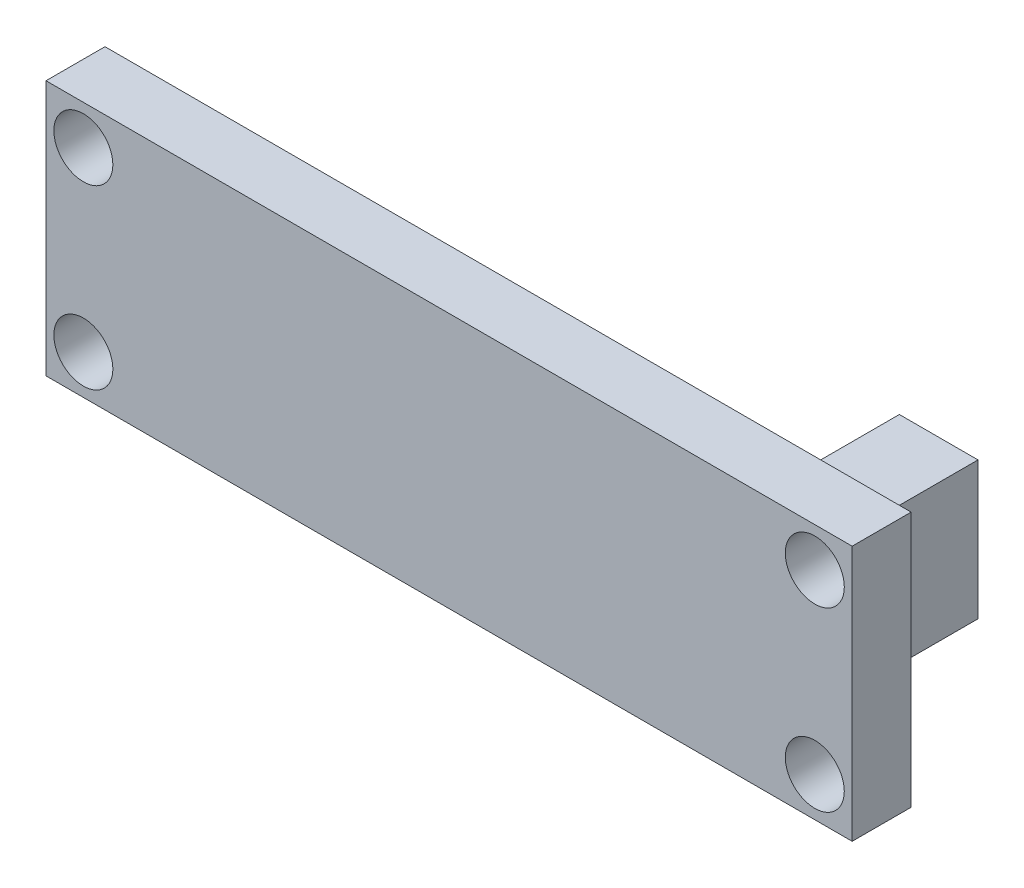
ISO-10303-21;
HEADER;
FILE_DESCRIPTION(('STEP AP214'),'2;1');
FILE_NAME('part.step','',(''),(''),'','','');
FILE_SCHEMA(('AUTOMOTIVE_DESIGN { 1 0 10303 214 1 1 1 1 }'));
ENDSEC;
DATA;
#1=APPLICATION_CONTEXT('core data for automotive mechanical design processes');
#2=APPLICATION_PROTOCOL_DEFINITION('international standard','automotive_design',2000,#1);
#3=PRODUCT_CONTEXT('',#1,'mechanical');
#4=PRODUCT('Part','Part','',(#3));
#5=PRODUCT_RELATED_PRODUCT_CATEGORY('part','',(#4));
#6=PRODUCT_DEFINITION_FORMATION('','',#4);
#7=PRODUCT_DEFINITION_CONTEXT('part definition',#1,'design');
#8=PRODUCT_DEFINITION('design','',#6,#7);
#9=PRODUCT_DEFINITION_SHAPE('','',#8);
#10=(LENGTH_UNIT() NAMED_UNIT(*) SI_UNIT(.MILLI.,.METRE.));
#11=(NAMED_UNIT(*) PLANE_ANGLE_UNIT() SI_UNIT($,.RADIAN.));
#12=(NAMED_UNIT(*) SI_UNIT($,.STERADIAN.) SOLID_ANGLE_UNIT());
#13=UNCERTAINTY_MEASURE_WITH_UNIT(LENGTH_MEASURE(1.E-05),#10,'distance_accuracy_value','');
#14=(GEOMETRIC_REPRESENTATION_CONTEXT(3) GLOBAL_UNCERTAINTY_ASSIGNED_CONTEXT((#13)) GLOBAL_UNIT_ASSIGNED_CONTEXT((#10,
#11,#12)) REPRESENTATION_CONTEXT('',''));
#15=CARTESIAN_POINT('',(0.,0.,0.));
#16=DIRECTION('',(0.,0.,1.));
#17=DIRECTION('',(1.,0.,0.));
#18=AXIS2_PLACEMENT_3D('',#15,#16,#17);
#19=CARTESIAN_POINT('',(0.,0.,0.));
#20=DIRECTION('',(0.,0.,1.));
#21=DIRECTION('',(1.,0.,0.));
#22=AXIS2_PLACEMENT_3D('',#19,#20,#21);
#23=PLANE('',#22);
#24=DIRECTION('',(0.,-1.,0.));
#25=VECTOR('',#24,1.);
#26=CARTESIAN_POINT('',(-41.,13.,0.));
#27=LINE('',#26,#25);
#28=CARTESIAN_POINT('',(-41.,13.,0.));
#29=VERTEX_POINT('',#28);
#30=CARTESIAN_POINT('',(-41.,0.,0.));
#31=VERTEX_POINT('',#30);
#32=EDGE_CURVE('E146',#29,#31,#27,.T.);
#33=ORIENTED_EDGE('',*,*,#32,.F.);
#34=DIRECTION('',(-1.,0.,0.));
#35=VECTOR('',#34,1.);
#36=CARTESIAN_POINT('',(-41.,13.,0.));
#37=LINE('',#36,#35);
#38=CARTESIAN_POINT('',(0.,13.,0.));
#39=VERTEX_POINT('',#38);
#40=EDGE_CURVE('E153',#39,#29,#37,.T.);
#41=ORIENTED_EDGE('',*,*,#40,.F.);
#42=DIRECTION('',(0.,1.,0.));
#43=VECTOR('',#42,1.);
#44=CARTESIAN_POINT('',(0.,13.,0.));
#45=LINE('',#44,#43);
#46=CARTESIAN_POINT('',(0.,0.,0.));
#47=VERTEX_POINT('',#46);
#48=EDGE_CURVE('E164',#47,#39,#45,.T.);
#49=ORIENTED_EDGE('',*,*,#48,.F.);
#50=DIRECTION('',(1.,0.,0.));
#51=VECTOR('',#50,1.);
#52=CARTESIAN_POINT('',(-41.,0.,0.));
#53=LINE('',#52,#51);
#54=EDGE_CURVE('E162',#31,#47,#53,.T.);
#55=ORIENTED_EDGE('',*,*,#54,.F.);
#56=EDGE_LOOP('',(#33,#41,#49,#55));
#57=FACE_BOUND('',#56,.T.);
#58=CARTESIAN_POINT('',(-1.9,11.,0.));
#59=DIRECTION('',(0.,0.,1.));
#60=DIRECTION('',(1.,0.,0.));
#61=AXIS2_PLACEMENT_3D('',#58,#59,#60);
#62=CIRCLE('',#61,1.5);
#63=CARTESIAN_POINT('',(-0.4,11.,0.));
#64=VERTEX_POINT('',#63);
#65=EDGE_CURVE('E143',#64,#64,#62,.T.);
#66=ORIENTED_EDGE('',*,*,#65,.T.);
#67=EDGE_LOOP('',(#66));
#68=FACE_BOUND('',#67,.T.);
#69=CARTESIAN_POINT('',(-39.1,2.,0.));
#70=DIRECTION('',(0.,0.,1.));
#71=DIRECTION('',(1.,0.,0.));
#72=AXIS2_PLACEMENT_3D('',#69,#70,#71);
#73=CIRCLE('',#72,1.5);
#74=CARTESIAN_POINT('',(-37.6,2.,0.));
#75=VERTEX_POINT('',#74);
#76=EDGE_CURVE('E122',#75,#75,#73,.T.);
#77=ORIENTED_EDGE('',*,*,#76,.T.);
#78=EDGE_LOOP('',(#77));
#79=FACE_BOUND('',#78,.T.);
#80=CARTESIAN_POINT('',(-39.1,11.,0.));
#81=DIRECTION('',(0.,0.,1.));
#82=DIRECTION('',(1.,0.,0.));
#83=AXIS2_PLACEMENT_3D('',#80,#81,#82);
#84=CIRCLE('',#83,1.5);
#85=CARTESIAN_POINT('',(-37.6,11.,0.));
#86=VERTEX_POINT('',#85);
#87=EDGE_CURVE('E138',#86,#86,#84,.T.);
#88=ORIENTED_EDGE('',*,*,#87,.T.);
#89=EDGE_LOOP('',(#88));
#90=FACE_BOUND('',#89,.T.);
#91=CARTESIAN_POINT('',(-1.9,2.,0.));
#92=DIRECTION('',(0.,0.,1.));
#93=DIRECTION('',(1.,0.,0.));
#94=AXIS2_PLACEMENT_3D('',#91,#92,#93);
#95=CIRCLE('',#94,1.5);
#96=CARTESIAN_POINT('',(-0.4,2.,0.));
#97=VERTEX_POINT('',#96);
#98=EDGE_CURVE('E131',#97,#97,#95,.T.);
#99=ORIENTED_EDGE('',*,*,#98,.T.);
#100=EDGE_LOOP('',(#99));
#101=FACE_BOUND('',#100,.T.);
#102=DIRECTION('',(0.,-1.,0.));
#103=VECTOR('',#102,1.);
#104=CARTESIAN_POINT('',(-3.6,10.,0.));
#105=LINE('',#104,#103);
#106=CARTESIAN_POINT('',(-3.6,10.,0.));
#107=VERTEX_POINT('',#106);
#108=CARTESIAN_POINT('',(-3.6,3.,0.));
#109=VERTEX_POINT('',#108);
#110=EDGE_CURVE('E118',#107,#109,#105,.T.);
#111=ORIENTED_EDGE('',*,*,#110,.F.);
#112=DIRECTION('',(1.,0.,0.));
#113=VECTOR('',#112,1.);
#114=CARTESIAN_POINT('',(-3.6,10.,0.));
#115=LINE('',#114,#113);
#116=CARTESIAN_POINT('',(-7.6,10.,0.));
#117=VERTEX_POINT('',#116);
#118=EDGE_CURVE('E115',#117,#107,#115,.T.);
#119=ORIENTED_EDGE('',*,*,#118,.F.);
#120=DIRECTION('',(0.,1.,0.));
#121=VECTOR('',#120,1.);
#122=CARTESIAN_POINT('',(-7.6,10.,0.));
#123=LINE('',#122,#121);
#124=CARTESIAN_POINT('',(-7.6,3.,0.));
#125=VERTEX_POINT('',#124);
#126=EDGE_CURVE('E53',#125,#117,#123,.T.);
#127=ORIENTED_EDGE('',*,*,#126,.F.);
#128=DIRECTION('',(-1.,0.,0.));
#129=VECTOR('',#128,1.);
#130=CARTESIAN_POINT('',(-3.6,3.,0.));
#131=LINE('',#130,#129);
#132=EDGE_CURVE('E48',#109,#125,#131,.T.);
#133=ORIENTED_EDGE('',*,*,#132,.F.);
#134=EDGE_LOOP('',(#111,#119,#127,#133));
#135=FACE_BOUND('',#134,.T.);
#136=ADVANCED_FACE('F33',(#57,#68,#79,#90,#101,#135),#23,.F.);
#137=CARTESIAN_POINT('',(-41.,13.,3.));
#138=DIRECTION('',(1.,0.,0.));
#139=DIRECTION('',(0.,1.,0.));
#140=AXIS2_PLACEMENT_3D('',#137,#138,#139);
#141=PLANE('',#140);
#142=ORIENTED_EDGE('',*,*,#32,.T.);
#143=DIRECTION('',(0.,0.,-1.));
#144=VECTOR('',#143,1.);
#145=CARTESIAN_POINT('',(-41.,0.,3.));
#146=LINE('',#145,#144);
#147=CARTESIAN_POINT('',(-41.,0.,3.));
#148=VERTEX_POINT('',#147);
#149=EDGE_CURVE('E11',#148,#31,#146,.T.);
#150=ORIENTED_EDGE('',*,*,#149,.F.);
#151=DIRECTION('',(0.,-1.,0.));
#152=VECTOR('',#151,1.);
#153=CARTESIAN_POINT('',(-41.,13.,3.));
#154=LINE('',#153,#152);
#155=CARTESIAN_POINT('',(-41.,13.,3.));
#156=VERTEX_POINT('',#155);
#157=EDGE_CURVE('E149',#156,#148,#154,.T.);
#158=ORIENTED_EDGE('',*,*,#157,.F.);
#159=DIRECTION('',(0.,0.,-1.));
#160=VECTOR('',#159,1.);
#161=CARTESIAN_POINT('',(-41.,13.,3.));
#162=LINE('',#161,#160);
#163=EDGE_CURVE('E159',#156,#29,#162,.T.);
#164=ORIENTED_EDGE('',*,*,#163,.T.);
#165=EDGE_LOOP('',(#142,#150,#158,#164));
#166=FACE_BOUND('',#165,.T.);
#167=ADVANCED_FACE('F35',(#166),#141,.F.);
#168=CARTESIAN_POINT('',(-41.,0.,3.));
#169=DIRECTION('',(0.,1.,0.));
#170=DIRECTION('',(0.,0.,1.));
#171=AXIS2_PLACEMENT_3D('',#168,#169,#170);
#172=PLANE('',#171);
#173=ORIENTED_EDGE('',*,*,#54,.T.);
#174=DIRECTION('',(0.,0.,-1.));
#175=VECTOR('',#174,1.);
#176=CARTESIAN_POINT('',(0.,0.,3.));
#177=LINE('',#176,#175);
#178=CARTESIAN_POINT('',(0.,0.,3.));
#179=VERTEX_POINT('',#178);
#180=EDGE_CURVE('E41',#179,#47,#177,.T.);
#181=ORIENTED_EDGE('',*,*,#180,.F.);
#182=DIRECTION('',(1.,0.,0.));
#183=VECTOR('',#182,1.);
#184=CARTESIAN_POINT('',(-41.,0.,3.));
#185=LINE('',#184,#183);
#186=EDGE_CURVE('E152',#148,#179,#185,.T.);
#187=ORIENTED_EDGE('',*,*,#186,.F.);
#188=ORIENTED_EDGE('',*,*,#149,.T.);
#189=EDGE_LOOP('',(#173,#181,#187,#188));
#190=FACE_BOUND('',#189,.T.);
#191=ADVANCED_FACE('F192',(#190),#172,.F.);
#192=CARTESIAN_POINT('',(0.,13.,3.));
#193=DIRECTION('',(-1.,0.,0.));
#194=DIRECTION('',(0.,-1.,0.));
#195=AXIS2_PLACEMENT_3D('',#192,#193,#194);
#196=PLANE('',#195);
#197=ORIENTED_EDGE('',*,*,#48,.T.);
#198=DIRECTION('',(0.,0.,-1.));
#199=VECTOR('',#198,1.);
#200=CARTESIAN_POINT('',(0.,13.,3.));
#201=LINE('',#200,#199);
#202=CARTESIAN_POINT('',(0.,13.,3.));
#203=VERTEX_POINT('',#202);
#204=EDGE_CURVE('E169',#203,#39,#201,.T.);
#205=ORIENTED_EDGE('',*,*,#204,.F.);
#206=DIRECTION('',(0.,1.,0.));
#207=VECTOR('',#206,1.);
#208=CARTESIAN_POINT('',(0.,13.,3.));
#209=LINE('',#208,#207);
#210=EDGE_CURVE('E155',#179,#203,#209,.T.);
#211=ORIENTED_EDGE('',*,*,#210,.F.);
#212=ORIENTED_EDGE('',*,*,#180,.T.);
#213=EDGE_LOOP('',(#197,#205,#211,#212));
#214=FACE_BOUND('',#213,.T.);
#215=ADVANCED_FACE('F176',(#214),#196,.F.);
#216=CARTESIAN_POINT('',(-41.,13.,3.));
#217=DIRECTION('',(0.,-1.,0.));
#218=DIRECTION('',(0.,0.,-1.));
#219=AXIS2_PLACEMENT_3D('',#216,#217,#218);
#220=PLANE('',#219);
#221=ORIENTED_EDGE('',*,*,#40,.T.);
#222=ORIENTED_EDGE('',*,*,#163,.F.);
#223=DIRECTION('',(-1.,0.,0.));
#224=VECTOR('',#223,1.);
#225=CARTESIAN_POINT('',(-41.,13.,3.));
#226=LINE('',#225,#224);
#227=EDGE_CURVE('E157',#203,#156,#226,.T.);
#228=ORIENTED_EDGE('',*,*,#227,.F.);
#229=ORIENTED_EDGE('',*,*,#204,.T.);
#230=EDGE_LOOP('',(#221,#222,#228,#229));
#231=FACE_BOUND('',#230,.T.);
#232=ADVANCED_FACE('F185',(#231),#220,.F.);
#233=CARTESIAN_POINT('',(0.,0.,3.));
#234=DIRECTION('',(0.,0.,1.));
#235=DIRECTION('',(1.,0.,0.));
#236=AXIS2_PLACEMENT_3D('',#233,#234,#235);
#237=PLANE('',#236);
#238=CARTESIAN_POINT('',(-1.9,2.,3.));
#239=DIRECTION('',(0.,0.,1.));
#240=DIRECTION('',(1.,0.,0.));
#241=AXIS2_PLACEMENT_3D('',#238,#239,#240);
#242=CIRCLE('',#241,1.5);
#243=CARTESIAN_POINT('',(-0.4,2.,3.));
#244=VERTEX_POINT('',#243);
#245=EDGE_CURVE('E135',#244,#244,#242,.T.);
#246=ORIENTED_EDGE('',*,*,#245,.F.);
#247=EDGE_LOOP('',(#246));
#248=FACE_BOUND('',#247,.T.);
#249=CARTESIAN_POINT('',(-39.1,11.,3.));
#250=DIRECTION('',(0.,0.,1.));
#251=DIRECTION('',(1.,0.,0.));
#252=AXIS2_PLACEMENT_3D('',#249,#250,#251);
#253=CIRCLE('',#252,1.5);
#254=CARTESIAN_POINT('',(-37.6,11.,3.));
#255=VERTEX_POINT('',#254);
#256=EDGE_CURVE('E129',#255,#255,#253,.T.);
#257=ORIENTED_EDGE('',*,*,#256,.F.);
#258=EDGE_LOOP('',(#257));
#259=FACE_BOUND('',#258,.T.);
#260=CARTESIAN_POINT('',(-39.1,2.,3.));
#261=DIRECTION('',(0.,0.,1.));
#262=DIRECTION('',(1.,0.,0.));
#263=AXIS2_PLACEMENT_3D('',#260,#261,#262);
#264=CIRCLE('',#263,1.5);
#265=CARTESIAN_POINT('',(-37.6,2.,3.));
#266=VERTEX_POINT('',#265);
#267=EDGE_CURVE('E119',#266,#266,#264,.T.);
#268=ORIENTED_EDGE('',*,*,#267,.F.);
#269=EDGE_LOOP('',(#268));
#270=FACE_BOUND('',#269,.T.);
#271=CARTESIAN_POINT('',(-1.9,11.,3.));
#272=DIRECTION('',(0.,0.,1.));
#273=DIRECTION('',(1.,0.,0.));
#274=AXIS2_PLACEMENT_3D('',#271,#272,#273);
#275=CIRCLE('',#274,1.5);
#276=CARTESIAN_POINT('',(-0.4,11.,3.));
#277=VERTEX_POINT('',#276);
#278=EDGE_CURVE('E134',#277,#277,#275,.T.);
#279=ORIENTED_EDGE('',*,*,#278,.F.);
#280=EDGE_LOOP('',(#279));
#281=FACE_BOUND('',#280,.T.);
#282=ORIENTED_EDGE('',*,*,#157,.T.);
#283=ORIENTED_EDGE('',*,*,#186,.T.);
#284=ORIENTED_EDGE('',*,*,#210,.T.);
#285=ORIENTED_EDGE('',*,*,#227,.T.);
#286=EDGE_LOOP('',(#282,#283,#284,#285));
#287=FACE_BOUND('',#286,.T.);
#288=ADVANCED_FACE('F191',(#248,#259,#270,#281,#287),#237,.T.);
#289=CARTESIAN_POINT('',(-1.9,11.,0.));
#290=DIRECTION('',(0.,0.,1.));
#291=DIRECTION('',(1.,0.,0.));
#292=AXIS2_PLACEMENT_3D('',#289,#290,#291);
#293=CYLINDRICAL_SURFACE('',#292,1.5);
#294=ORIENTED_EDGE('',*,*,#65,.F.);
#295=EDGE_LOOP('',(#294));
#296=FACE_BOUND('',#295,.T.);
#297=ORIENTED_EDGE('',*,*,#278,.T.);
#298=EDGE_LOOP('',(#297));
#299=FACE_BOUND('',#298,.T.);
#300=ADVANCED_FACE('F210',(#296,#299),#293,.F.);
#301=CARTESIAN_POINT('',(-39.1,2.,0.));
#302=DIRECTION('',(0.,0.,1.));
#303=DIRECTION('',(1.,0.,0.));
#304=AXIS2_PLACEMENT_3D('',#301,#302,#303);
#305=CYLINDRICAL_SURFACE('',#304,1.5);
#306=ORIENTED_EDGE('',*,*,#76,.F.);
#307=EDGE_LOOP('',(#306));
#308=FACE_BOUND('',#307,.T.);
#309=ORIENTED_EDGE('',*,*,#267,.T.);
#310=EDGE_LOOP('',(#309));
#311=FACE_BOUND('',#310,.T.);
#312=ADVANCED_FACE('F215',(#308,#311),#305,.F.);
#313=CARTESIAN_POINT('',(-39.1,11.,0.));
#314=DIRECTION('',(0.,0.,1.));
#315=DIRECTION('',(1.,0.,0.));
#316=AXIS2_PLACEMENT_3D('',#313,#314,#315);
#317=CYLINDRICAL_SURFACE('',#316,1.5);
#318=ORIENTED_EDGE('',*,*,#87,.F.);
#319=EDGE_LOOP('',(#318));
#320=FACE_BOUND('',#319,.T.);
#321=ORIENTED_EDGE('',*,*,#256,.T.);
#322=EDGE_LOOP('',(#321));
#323=FACE_BOUND('',#322,.T.);
#324=ADVANCED_FACE('F227',(#320,#323),#317,.F.);
#325=CARTESIAN_POINT('',(-1.9,2.,0.));
#326=DIRECTION('',(0.,0.,1.));
#327=DIRECTION('',(1.,0.,0.));
#328=AXIS2_PLACEMENT_3D('',#325,#326,#327);
#329=CYLINDRICAL_SURFACE('',#328,1.5);
#330=ORIENTED_EDGE('',*,*,#98,.F.);
#331=EDGE_LOOP('',(#330));
#332=FACE_BOUND('',#331,.T.);
#333=ORIENTED_EDGE('',*,*,#245,.T.);
#334=EDGE_LOOP('',(#333));
#335=FACE_BOUND('',#334,.T.);
#336=ADVANCED_FACE('F233',(#332,#335),#329,.F.);
#337=CARTESIAN_POINT('',(-3.6,10.,-7.));
#338=DIRECTION('',(-1.,0.,0.));
#339=DIRECTION('',(0.,-1.,0.));
#340=AXIS2_PLACEMENT_3D('',#337,#338,#339);
#341=PLANE('',#340);
#342=ORIENTED_EDGE('',*,*,#110,.T.);
#343=DIRECTION('',(0.,0.,1.));
#344=VECTOR('',#343,1.);
#345=CARTESIAN_POINT('',(-3.6,3.,-7.));
#346=LINE('',#345,#344);
#347=CARTESIAN_POINT('',(-3.6,3.,-7.));
#348=VERTEX_POINT('',#347);
#349=EDGE_CURVE('E99',#348,#109,#346,.T.);
#350=ORIENTED_EDGE('',*,*,#349,.F.);
#351=DIRECTION('',(0.,-1.,0.));
#352=VECTOR('',#351,1.);
#353=CARTESIAN_POINT('',(-3.6,10.,-7.));
#354=LINE('',#353,#352);
#355=CARTESIAN_POINT('',(-3.6,10.,-7.));
#356=VERTEX_POINT('',#355);
#357=EDGE_CURVE('E106',#356,#348,#354,.T.);
#358=ORIENTED_EDGE('',*,*,#357,.F.);
#359=DIRECTION('',(0.,0.,1.));
#360=VECTOR('',#359,1.);
#361=CARTESIAN_POINT('',(-3.6,10.,-7.));
#362=LINE('',#361,#360);
#363=EDGE_CURVE('E253',#356,#107,#362,.T.);
#364=ORIENTED_EDGE('',*,*,#363,.T.);
#365=EDGE_LOOP('',(#342,#350,#358,#364));
#366=FACE_BOUND('',#365,.T.);
#367=ADVANCED_FACE('F117',(#366),#341,.F.);
#368=CARTESIAN_POINT('',(-3.6,3.,-7.));
#369=DIRECTION('',(0.,1.,0.));
#370=DIRECTION('',(0.,0.,1.));
#371=AXIS2_PLACEMENT_3D('',#368,#369,#370);
#372=PLANE('',#371);
#373=ORIENTED_EDGE('',*,*,#132,.T.);
#374=DIRECTION('',(0.,0.,1.));
#375=VECTOR('',#374,1.);
#376=CARTESIAN_POINT('',(-7.6,3.,-7.));
#377=LINE('',#376,#375);
#378=CARTESIAN_POINT('',(-7.6,3.,-7.));
#379=VERTEX_POINT('',#378);
#380=EDGE_CURVE('E102',#379,#125,#377,.T.);
#381=ORIENTED_EDGE('',*,*,#380,.F.);
#382=DIRECTION('',(-1.,0.,0.));
#383=VECTOR('',#382,1.);
#384=CARTESIAN_POINT('',(-3.6,3.,-7.));
#385=LINE('',#384,#383);
#386=EDGE_CURVE('E95',#348,#379,#385,.T.);
#387=ORIENTED_EDGE('',*,*,#386,.F.);
#388=ORIENTED_EDGE('',*,*,#349,.T.);
#389=EDGE_LOOP('',(#373,#381,#387,#388));
#390=FACE_BOUND('',#389,.T.);
#391=ADVANCED_FACE('F97',(#390),#372,.F.);
#392=CARTESIAN_POINT('',(-7.6,10.,-7.));
#393=DIRECTION('',(1.,0.,0.));
#394=DIRECTION('',(0.,1.,0.));
#395=AXIS2_PLACEMENT_3D('',#392,#393,#394);
#396=PLANE('',#395);
#397=ORIENTED_EDGE('',*,*,#126,.T.);
#398=DIRECTION('',(0.,0.,1.));
#399=VECTOR('',#398,1.);
#400=CARTESIAN_POINT('',(-7.6,10.,-7.));
#401=LINE('',#400,#399);
#402=CARTESIAN_POINT('',(-7.6,10.,-7.));
#403=VERTEX_POINT('',#402);
#404=EDGE_CURVE('E124',#403,#117,#401,.T.);
#405=ORIENTED_EDGE('',*,*,#404,.F.);
#406=DIRECTION('',(0.,1.,0.));
#407=VECTOR('',#406,1.);
#408=CARTESIAN_POINT('',(-7.6,10.,-7.));
#409=LINE('',#408,#407);
#410=EDGE_CURVE('E105',#379,#403,#409,.T.);
#411=ORIENTED_EDGE('',*,*,#410,.F.);
#412=ORIENTED_EDGE('',*,*,#380,.T.);
#413=EDGE_LOOP('',(#397,#405,#411,#412));
#414=FACE_BOUND('',#413,.T.);
#415=ADVANCED_FACE('F262',(#414),#396,.F.);
#416=CARTESIAN_POINT('',(-3.6,10.,-7.));
#417=DIRECTION('',(0.,-1.,0.));
#418=DIRECTION('',(0.,0.,-1.));
#419=AXIS2_PLACEMENT_3D('',#416,#417,#418);
#420=PLANE('',#419);
#421=ORIENTED_EDGE('',*,*,#118,.T.);
#422=ORIENTED_EDGE('',*,*,#363,.F.);
#423=DIRECTION('',(1.,0.,0.));
#424=VECTOR('',#423,1.);
#425=CARTESIAN_POINT('',(-3.6,10.,-7.));
#426=LINE('',#425,#424);
#427=EDGE_CURVE('E111',#403,#356,#426,.T.);
#428=ORIENTED_EDGE('',*,*,#427,.F.);
#429=ORIENTED_EDGE('',*,*,#404,.T.);
#430=EDGE_LOOP('',(#421,#422,#428,#429));
#431=FACE_BOUND('',#430,.T.);
#432=ADVANCED_FACE('F252',(#431),#420,.F.);
#433=CARTESIAN_POINT('',(0.,0.,-7.));
#434=DIRECTION('',(0.,0.,-1.));
#435=DIRECTION('',(-1.,0.,0.));
#436=AXIS2_PLACEMENT_3D('',#433,#434,#435);
#437=PLANE('',#436);
#438=ORIENTED_EDGE('',*,*,#357,.T.);
#439=ORIENTED_EDGE('',*,*,#386,.T.);
#440=ORIENTED_EDGE('',*,*,#410,.T.);
#441=ORIENTED_EDGE('',*,*,#427,.T.);
#442=EDGE_LOOP('',(#438,#439,#440,#441));
#443=FACE_BOUND('',#442,.T.);
#444=ADVANCED_FACE('F109',(#443),#437,.T.);
#445=CLOSED_SHELL('',(#136,#167,#191,#215,#232,#288,#300,#312,#324,#336,#367,#391,#415,#432,#444));
#446=MANIFOLD_SOLID_BREP('B2',#445);
#447=ADVANCED_BREP_SHAPE_REPRESENTATION('',(#18,#446),#14);
#448=SHAPE_DEFINITION_REPRESENTATION(#9,#447);
ENDSEC;
END-ISO-10303-21;
